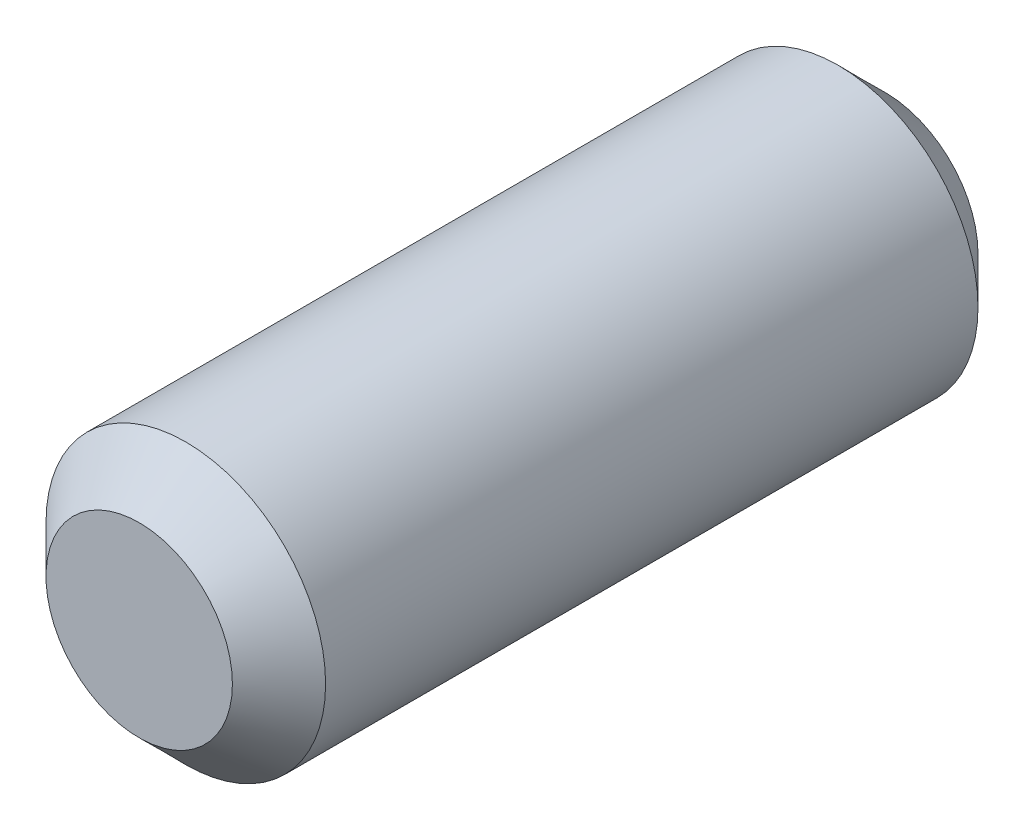
ISO-10303-21;
HEADER;
FILE_DESCRIPTION(('STEP AP214'),'2;1');
FILE_NAME('part.step','',(''),(''),'','','');
FILE_SCHEMA(('AUTOMOTIVE_DESIGN { 1 0 10303 214 1 1 1 1 }'));
ENDSEC;
DATA;
#1=APPLICATION_CONTEXT('core data for automotive mechanical design processes');
#2=APPLICATION_PROTOCOL_DEFINITION('international standard','automotive_design',2000,#1);
#3=PRODUCT_CONTEXT('',#1,'mechanical');
#4=PRODUCT('Part','Part','',(#3));
#5=PRODUCT_RELATED_PRODUCT_CATEGORY('part','',(#4));
#6=PRODUCT_DEFINITION_FORMATION('','',#4);
#7=PRODUCT_DEFINITION_CONTEXT('part definition',#1,'design');
#8=PRODUCT_DEFINITION('design','',#6,#7);
#9=PRODUCT_DEFINITION_SHAPE('','',#8);
#10=(LENGTH_UNIT() NAMED_UNIT(*) SI_UNIT(.MILLI.,.METRE.));
#11=(NAMED_UNIT(*) PLANE_ANGLE_UNIT() SI_UNIT($,.RADIAN.));
#12=(NAMED_UNIT(*) SI_UNIT($,.STERADIAN.) SOLID_ANGLE_UNIT());
#13=UNCERTAINTY_MEASURE_WITH_UNIT(LENGTH_MEASURE(1.E-05),#10,'distance_accuracy_value','');
#14=(GEOMETRIC_REPRESENTATION_CONTEXT(3) GLOBAL_UNCERTAINTY_ASSIGNED_CONTEXT((#13)) GLOBAL_UNIT_ASSIGNED_CONTEXT((#10,
#11,#12)) REPRESENTATION_CONTEXT('',''));
#15=CARTESIAN_POINT('',(0.,0.,0.));
#16=DIRECTION('',(0.,0.,1.));
#17=DIRECTION('',(1.,0.,0.));
#18=AXIS2_PLACEMENT_3D('',#15,#16,#17);
#19=CARTESIAN_POINT('',(0.,0.,8.));
#20=DIRECTION('',(0.,0.,-1.));
#21=DIRECTION('',(-1.,0.,0.));
#22=AXIS2_PLACEMENT_3D('',#19,#20,#21);
#23=CYLINDRICAL_SURFACE('',#22,1.5);
#24=CARTESIAN_POINT('',(0.,0.,0.5));
#25=DIRECTION('',(0.,0.,1.));
#26=DIRECTION('',(1.,0.,0.));
#27=AXIS2_PLACEMENT_3D('',#24,#25,#26);
#28=CIRCLE('',#27,1.5);
#29=CARTESIAN_POINT('',(1.5,0.,0.5));
#30=VERTEX_POINT('',#29);
#31=EDGE_CURVE('E55',#30,#30,#28,.T.);
#32=ORIENTED_EDGE('',*,*,#31,.T.);
#33=EDGE_LOOP('',(#32));
#34=FACE_BOUND('',#33,.T.);
#35=CARTESIAN_POINT('',(0.,0.,7.5));
#36=DIRECTION('',(0.,0.,1.));
#37=DIRECTION('',(1.,0.,0.));
#38=AXIS2_PLACEMENT_3D('',#35,#36,#37);
#39=CIRCLE('',#38,1.5);
#40=CARTESIAN_POINT('',(1.5,0.,7.5));
#41=VERTEX_POINT('',#40);
#42=EDGE_CURVE('E59',#41,#41,#39,.F.);
#43=ORIENTED_EDGE('',*,*,#42,.T.);
#44=EDGE_LOOP('',(#43));
#45=FACE_BOUND('',#44,.T.);
#46=ADVANCED_FACE('F43',(#34,#45),#23,.T.);
#47=CARTESIAN_POINT('',(0.,0.,8.));
#48=DIRECTION('',(0.,0.,1.));
#49=DIRECTION('',(1.,0.,0.));
#50=AXIS2_PLACEMENT_3D('',#47,#48,#49);
#51=PLANE('',#50);
#52=CARTESIAN_POINT('',(0.,0.,8.));
#53=DIRECTION('',(0.,0.,1.));
#54=DIRECTION('',(1.,0.,0.));
#55=AXIS2_PLACEMENT_3D('',#52,#53,#54);
#56=CIRCLE('',#55,1.);
#57=CARTESIAN_POINT('',(1.,0.,8.));
#58=VERTEX_POINT('',#57);
#59=EDGE_CURVE('E10',#58,#58,#56,.T.);
#60=ORIENTED_EDGE('',*,*,#59,.T.);
#61=EDGE_LOOP('',(#60));
#62=FACE_BOUND('',#61,.T.);
#63=ADVANCED_FACE('F75',(#62),#51,.T.);
#64=CARTESIAN_POINT('',(0.,0.,0.));
#65=DIRECTION('',(0.,0.,1.));
#66=DIRECTION('',(1.,0.,0.));
#67=AXIS2_PLACEMENT_3D('',#64,#65,#66);
#68=PLANE('',#67);
#69=CARTESIAN_POINT('',(0.,0.,0.));
#70=DIRECTION('',(0.,0.,1.));
#71=DIRECTION('',(1.,0.,0.));
#72=AXIS2_PLACEMENT_3D('',#69,#70,#71);
#73=CIRCLE('',#72,0.999999999999999);
#74=CARTESIAN_POINT('',(0.999999999999999,0.,0.));
#75=VERTEX_POINT('',#74);
#76=EDGE_CURVE('E51',#75,#75,#73,.F.);
#77=ORIENTED_EDGE('',*,*,#76,.T.);
#78=EDGE_LOOP('',(#77));
#79=FACE_BOUND('',#78,.T.);
#80=ADVANCED_FACE('F72',(#79),#68,.F.);
#81=CARTESIAN_POINT('',(0.,0.,0.5));
#82=DIRECTION('',(0.,0.,1.));
#83=DIRECTION('',(1.,0.,0.));
#84=AXIS2_PLACEMENT_3D('',#81,#82,#83);
#85=CONICAL_SURFACE('',#84,1.5,0.785398163397449);
#86=ORIENTED_EDGE('',*,*,#76,.F.);
#87=EDGE_LOOP('',(#86));
#88=FACE_BOUND('',#87,.T.);
#89=ORIENTED_EDGE('',*,*,#31,.F.);
#90=EDGE_LOOP('',(#89));
#91=FACE_BOUND('',#90,.T.);
#92=ADVANCED_FACE('F68',(#88,#91),#85,.T.);
#93=CARTESIAN_POINT('',(0.,0.,8.));
#94=DIRECTION('',(0.,0.,-1.));
#95=DIRECTION('',(-1.,0.,0.));
#96=AXIS2_PLACEMENT_3D('',#93,#94,#95);
#97=CONICAL_SURFACE('',#96,1.,0.785398163397446);
#98=ORIENTED_EDGE('',*,*,#42,.F.);
#99=EDGE_LOOP('',(#98));
#100=FACE_BOUND('',#99,.T.);
#101=ORIENTED_EDGE('',*,*,#59,.F.);
#102=EDGE_LOOP('',(#101));
#103=FACE_BOUND('',#102,.T.);
#104=ADVANCED_FACE('F46',(#100,#103),#97,.T.);
#105=CLOSED_SHELL('',(#46,#63,#80,#92,#104));
#106=MANIFOLD_SOLID_BREP('B2',#105);
#107=ADVANCED_BREP_SHAPE_REPRESENTATION('',(#18,#106),#14);
#108=SHAPE_DEFINITION_REPRESENTATION(#9,#107);
ENDSEC;
END-ISO-10303-21;
